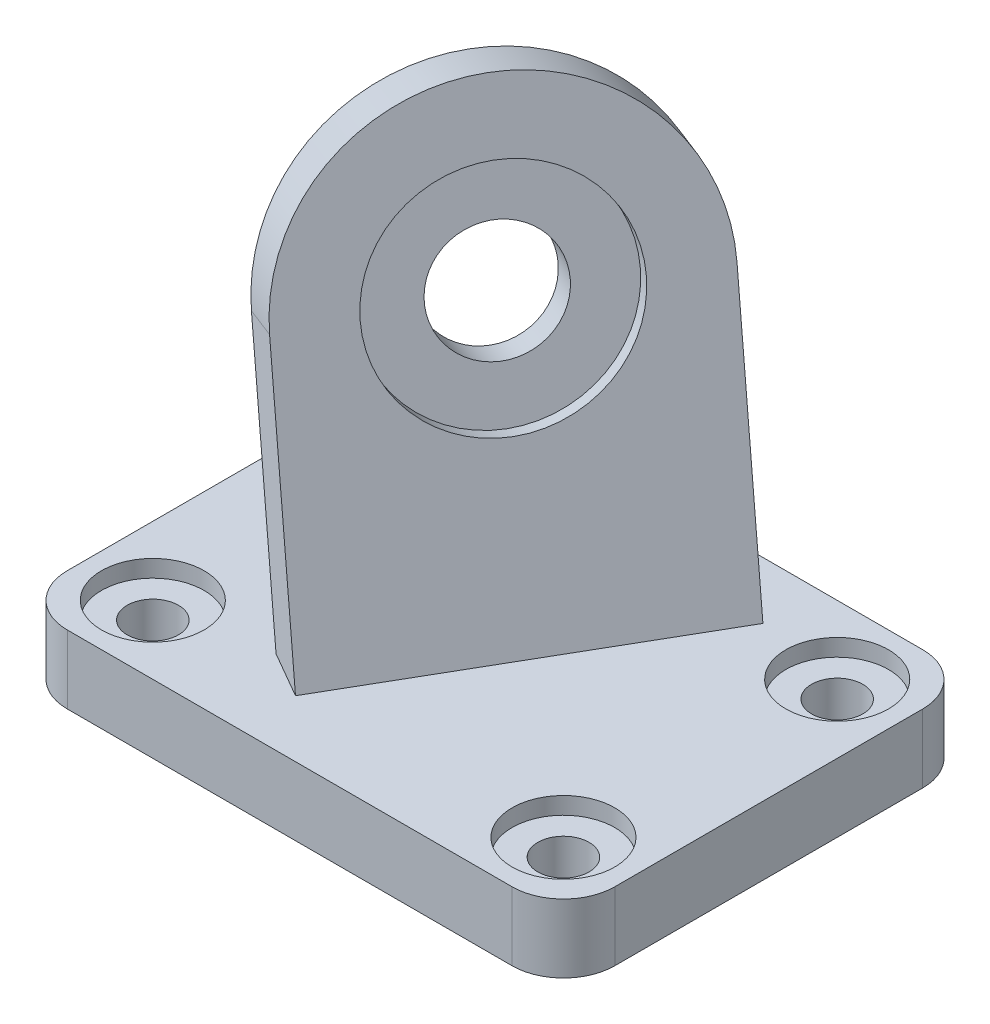
ISO-10303-21;
HEADER;
FILE_DESCRIPTION(('STEP AP214'),'2;1');
FILE_NAME('part.step','',(''),(''),'','','');
FILE_SCHEMA(('AUTOMOTIVE_DESIGN { 1 0 10303 214 1 1 1 1 }'));
ENDSEC;
DATA;
#1=APPLICATION_CONTEXT('core data for automotive mechanical design processes');
#2=APPLICATION_PROTOCOL_DEFINITION('international standard','automotive_design',2000,#1);
#3=PRODUCT_CONTEXT('',#1,'mechanical');
#4=PRODUCT('Part','Part','',(#3));
#5=PRODUCT_RELATED_PRODUCT_CATEGORY('part','',(#4));
#6=PRODUCT_DEFINITION_FORMATION('','',#4);
#7=PRODUCT_DEFINITION_CONTEXT('part definition',#1,'design');
#8=PRODUCT_DEFINITION('design','',#6,#7);
#9=PRODUCT_DEFINITION_SHAPE('','',#8);
#10=(LENGTH_UNIT() NAMED_UNIT(*) SI_UNIT(.MILLI.,.METRE.));
#11=(NAMED_UNIT(*) PLANE_ANGLE_UNIT() SI_UNIT($,.RADIAN.));
#12=(NAMED_UNIT(*) SI_UNIT($,.STERADIAN.) SOLID_ANGLE_UNIT());
#13=UNCERTAINTY_MEASURE_WITH_UNIT(LENGTH_MEASURE(1.E-05),#10,'distance_accuracy_value','');
#14=(GEOMETRIC_REPRESENTATION_CONTEXT(3) GLOBAL_UNCERTAINTY_ASSIGNED_CONTEXT((#13)) GLOBAL_UNIT_ASSIGNED_CONTEXT((#10,
#11,#12)) REPRESENTATION_CONTEXT('',''));
#15=CARTESIAN_POINT('',(0.,0.,0.));
#16=DIRECTION('',(0.,0.,1.));
#17=DIRECTION('',(1.,0.,0.));
#18=AXIS2_PLACEMENT_3D('',#15,#16,#17);
#19=CARTESIAN_POINT('',(50.8,12.7,38.1));
#20=DIRECTION('',(-1.,0.,0.));
#21=DIRECTION('',(0.,0.,1.));
#22=AXIS2_PLACEMENT_3D('',#19,#20,#21);
#23=PLANE('',#22);
#24=DIRECTION('',(0.,0.,-1.));
#25=VECTOR('',#24,1.);
#26=CARTESIAN_POINT('',(50.8,0.,38.1));
#27=LINE('',#26,#25);
#28=CARTESIAN_POINT('',(50.8,0.,28.575));
#29=VERTEX_POINT('',#28);
#30=CARTESIAN_POINT('',(50.8,0.,-28.575));
#31=VERTEX_POINT('',#30);
#32=EDGE_CURVE('E164',#29,#31,#27,.T.);
#33=ORIENTED_EDGE('',*,*,#32,.T.);
#34=DIRECTION('',(0.,-1.,0.));
#35=VECTOR('',#34,1.);
#36=CARTESIAN_POINT('',(50.8,12.7,-28.575));
#37=LINE('',#36,#35);
#38=CARTESIAN_POINT('',(50.8,12.7,-28.575));
#39=VERTEX_POINT('',#38);
#40=EDGE_CURVE('E11',#31,#39,#37,.F.);
#41=ORIENTED_EDGE('',*,*,#40,.T.);
#42=DIRECTION('',(0.,0.,-1.));
#43=VECTOR('',#42,1.);
#44=CARTESIAN_POINT('',(50.8,12.7,38.1));
#45=LINE('',#44,#43);
#46=CARTESIAN_POINT('',(50.8,12.7,28.575));
#47=VERTEX_POINT('',#46);
#48=EDGE_CURVE('E166',#47,#39,#45,.T.);
#49=ORIENTED_EDGE('',*,*,#48,.F.);
#50=DIRECTION('',(0.,-1.,0.));
#51=VECTOR('',#50,1.);
#52=CARTESIAN_POINT('',(50.8,12.7,28.575));
#53=LINE('',#52,#51);
#54=EDGE_CURVE('E44',#47,#29,#53,.T.);
#55=ORIENTED_EDGE('',*,*,#54,.T.);
#56=EDGE_LOOP('',(#33,#41,#49,#55));
#57=FACE_BOUND('',#56,.T.);
#58=ADVANCED_FACE('F36',(#57),#23,.F.);
#59=CARTESIAN_POINT('',(-50.8,12.7,-38.1));
#60=DIRECTION('',(0.,0.,1.));
#61=DIRECTION('',(1.,0.,0.));
#62=AXIS2_PLACEMENT_3D('',#59,#60,#61);
#63=PLANE('',#62);
#64=DIRECTION('',(-1.,0.,0.));
#65=VECTOR('',#64,1.);
#66=CARTESIAN_POINT('',(-50.8,0.,-38.1));
#67=LINE('',#66,#65);
#68=CARTESIAN_POINT('',(41.275,0.,-38.1));
#69=VERTEX_POINT('',#68);
#70=CARTESIAN_POINT('',(-41.275,0.,-38.1));
#71=VERTEX_POINT('',#70);
#72=EDGE_CURVE('E179',#69,#71,#67,.T.);
#73=ORIENTED_EDGE('',*,*,#72,.T.);
#74=DIRECTION('',(0.,-1.,0.));
#75=VECTOR('',#74,1.);
#76=CARTESIAN_POINT('',(-41.275,12.7,-38.1));
#77=LINE('',#76,#75);
#78=CARTESIAN_POINT('',(-41.275,12.7,-38.1));
#79=VERTEX_POINT('',#78);
#80=EDGE_CURVE('E51',#71,#79,#77,.F.);
#81=ORIENTED_EDGE('',*,*,#80,.T.);
#82=DIRECTION('',(-1.,0.,0.));
#83=VECTOR('',#82,1.);
#84=CARTESIAN_POINT('',(-50.8,12.7,-38.1));
#85=LINE('',#84,#83);
#86=CARTESIAN_POINT('',(41.275,12.7,-38.1));
#87=VERTEX_POINT('',#86);
#88=EDGE_CURVE('E168',#87,#79,#85,.T.);
#89=ORIENTED_EDGE('',*,*,#88,.F.);
#90=DIRECTION('',(0.,-1.,0.));
#91=VECTOR('',#90,1.);
#92=CARTESIAN_POINT('',(41.275,12.7,-38.1));
#93=LINE('',#92,#91);
#94=EDGE_CURVE('E219',#87,#69,#93,.T.);
#95=ORIENTED_EDGE('',*,*,#94,.T.);
#96=EDGE_LOOP('',(#73,#81,#89,#95));
#97=FACE_BOUND('',#96,.T.);
#98=ADVANCED_FACE('F237',(#97),#63,.F.);
#99=CARTESIAN_POINT('',(-50.8,12.7,38.1));
#100=DIRECTION('',(1.,0.,0.));
#101=DIRECTION('',(0.,0.,-1.));
#102=AXIS2_PLACEMENT_3D('',#99,#100,#101);
#103=PLANE('',#102);
#104=DIRECTION('',(0.,0.,1.));
#105=VECTOR('',#104,1.);
#106=CARTESIAN_POINT('',(-50.8,0.,38.1));
#107=LINE('',#106,#105);
#108=CARTESIAN_POINT('',(-50.8,0.,-28.575));
#109=VERTEX_POINT('',#108);
#110=CARTESIAN_POINT('',(-50.8,0.,28.575));
#111=VERTEX_POINT('',#110);
#112=EDGE_CURVE('E181',#109,#111,#107,.T.);
#113=ORIENTED_EDGE('',*,*,#112,.T.);
#114=DIRECTION('',(0.,-1.,0.));
#115=VECTOR('',#114,1.);
#116=CARTESIAN_POINT('',(-50.8,12.7,28.575));
#117=LINE('',#116,#115);
#118=CARTESIAN_POINT('',(-50.8,12.7,28.575));
#119=VERTEX_POINT('',#118);
#120=EDGE_CURVE('E210',#111,#119,#117,.F.);
#121=ORIENTED_EDGE('',*,*,#120,.T.);
#122=DIRECTION('',(0.,0.,1.));
#123=VECTOR('',#122,1.);
#124=CARTESIAN_POINT('',(-50.8,12.7,38.1));
#125=LINE('',#124,#123);
#126=CARTESIAN_POINT('',(-50.8,12.7,-28.575));
#127=VERTEX_POINT('',#126);
#128=EDGE_CURVE('E171',#127,#119,#125,.T.);
#129=ORIENTED_EDGE('',*,*,#128,.F.);
#130=DIRECTION('',(0.,-1.,0.));
#131=VECTOR('',#130,1.);
#132=CARTESIAN_POINT('',(-50.8,12.7,-28.575));
#133=LINE('',#132,#131);
#134=EDGE_CURVE('E207',#127,#109,#133,.T.);
#135=ORIENTED_EDGE('',*,*,#134,.T.);
#136=EDGE_LOOP('',(#113,#121,#129,#135));
#137=FACE_BOUND('',#136,.T.);
#138=ADVANCED_FACE('F246',(#137),#103,.F.);
#139=CARTESIAN_POINT('',(-50.8,12.7,38.1));
#140=DIRECTION('',(0.,0.,-1.));
#141=DIRECTION('',(-1.,0.,0.));
#142=AXIS2_PLACEMENT_3D('',#139,#140,#141);
#143=PLANE('',#142);
#144=DIRECTION('',(1.,0.,0.));
#145=VECTOR('',#144,1.);
#146=CARTESIAN_POINT('',(-50.8,12.7,38.1));
#147=LINE('',#146,#145);
#148=CARTESIAN_POINT('',(-41.275,12.7,38.1));
#149=VERTEX_POINT('',#148);
#150=CARTESIAN_POINT('',(41.275,12.7,38.1));
#151=VERTEX_POINT('',#150);
#152=EDGE_CURVE('E174',#149,#151,#147,.T.);
#153=ORIENTED_EDGE('',*,*,#152,.F.);
#154=DIRECTION('',(0.,-1.,0.));
#155=VECTOR('',#154,1.);
#156=CARTESIAN_POINT('',(-41.275,12.7,38.1));
#157=LINE('',#156,#155);
#158=CARTESIAN_POINT('',(-41.275,0.,38.1));
#159=VERTEX_POINT('',#158);
#160=EDGE_CURVE('E196',#149,#159,#157,.T.);
#161=ORIENTED_EDGE('',*,*,#160,.T.);
#162=DIRECTION('',(1.,0.,0.));
#163=VECTOR('',#162,1.);
#164=CARTESIAN_POINT('',(-50.8,0.,38.1));
#165=LINE('',#164,#163);
#166=CARTESIAN_POINT('',(41.275,0.,38.1));
#167=VERTEX_POINT('',#166);
#168=EDGE_CURVE('E169',#159,#167,#165,.T.);
#169=ORIENTED_EDGE('',*,*,#168,.T.);
#170=DIRECTION('',(0.,-1.,0.));
#171=VECTOR('',#170,1.);
#172=CARTESIAN_POINT('',(41.275,12.7,38.1));
#173=LINE('',#172,#171);
#174=EDGE_CURVE('E191',#167,#151,#173,.F.);
#175=ORIENTED_EDGE('',*,*,#174,.T.);
#176=EDGE_LOOP('',(#153,#161,#169,#175));
#177=FACE_BOUND('',#176,.T.);
#178=ADVANCED_FACE('F254',(#177),#143,.F.);
#179=CARTESIAN_POINT('',(0.,12.7,0.));
#180=DIRECTION('',(0.,-1.,0.));
#181=DIRECTION('',(0.,0.,-1.));
#182=AXIS2_PLACEMENT_3D('',#179,#180,#181);
#183=PLANE('',#182);
#184=CARTESIAN_POINT('',(-38.1,12.7,-25.4));
#185=DIRECTION('',(0.,1.,0.));
#186=DIRECTION('',(0.,0.,1.));
#187=AXIS2_PLACEMENT_3D('',#184,#185,#186);
#188=CIRCLE('',#187,9.525);
#189=CARTESIAN_POINT('',(-38.1,12.7,-15.875));
#190=VERTEX_POINT('',#189);
#191=EDGE_CURVE('E534',#190,#190,#188,.T.);
#192=ORIENTED_EDGE('',*,*,#191,.F.);
#193=EDGE_LOOP('',(#192));
#194=FACE_BOUND('',#193,.T.);
#195=CARTESIAN_POINT('',(38.1,12.7,-25.4));
#196=DIRECTION('',(0.,1.,0.));
#197=DIRECTION('',(0.,0.,1.));
#198=AXIS2_PLACEMENT_3D('',#195,#196,#197);
#199=CIRCLE('',#198,9.525);
#200=CARTESIAN_POINT('',(38.1,12.7,-15.875));
#201=VERTEX_POINT('',#200);
#202=EDGE_CURVE('E538',#201,#201,#199,.T.);
#203=ORIENTED_EDGE('',*,*,#202,.F.);
#204=EDGE_LOOP('',(#203));
#205=FACE_BOUND('',#204,.T.);
#206=CARTESIAN_POINT('',(38.1,12.7,25.4));
#207=DIRECTION('',(0.,1.,0.));
#208=DIRECTION('',(0.,0.,1.));
#209=AXIS2_PLACEMENT_3D('',#206,#207,#208);
#210=CIRCLE('',#209,9.525);
#211=CARTESIAN_POINT('',(38.1,12.7,34.925));
#212=VERTEX_POINT('',#211);
#213=EDGE_CURVE('E542',#212,#212,#210,.T.);
#214=ORIENTED_EDGE('',*,*,#213,.F.);
#215=EDGE_LOOP('',(#214));
#216=FACE_BOUND('',#215,.T.);
#217=CARTESIAN_POINT('',(-38.1,12.7,25.4));
#218=DIRECTION('',(0.,1.,0.));
#219=DIRECTION('',(0.,0.,1.));
#220=AXIS2_PLACEMENT_3D('',#217,#218,#219);
#221=CIRCLE('',#220,9.525);
#222=CARTESIAN_POINT('',(-38.1,12.7,34.925));
#223=VERTEX_POINT('',#222);
#224=EDGE_CURVE('E546',#223,#223,#221,.T.);
#225=ORIENTED_EDGE('',*,*,#224,.F.);
#226=EDGE_LOOP('',(#225));
#227=FACE_BOUND('',#226,.T.);
#228=DIRECTION('',(-0.866025403784439,0.,-0.5));
#229=VECTOR('',#228,1.);
#230=CARTESIAN_POINT('',(-14.2875,12.7,24.7466759131403));
#231=LINE('',#230,#229);
#232=CARTESIAN_POINT('',(-9.525,12.7,27.4963065701559));
#233=VERTEX_POINT('',#232);
#234=CARTESIAN_POINT('',(-18.0648813724007,12.7,22.5658037609529));
#235=VERTEX_POINT('',#234);
#236=EDGE_CURVE('E187',#233,#235,#231,.T.);
#237=ORIENTED_EDGE('',*,*,#236,.T.);
#238=DIRECTION('',(0.5,0.,-0.866025403784439));
#239=VECTOR('',#238,1.);
#240=CARTESIAN_POINT('',(-3.7773813724007,12.7,-2.18087215218742));
#241=LINE('',#240,#239);
#242=CARTESIAN_POINT('',(13.6851186275993,12.7,-32.426809379359));
#243=VERTEX_POINT('',#242);
#244=EDGE_CURVE('E189',#235,#243,#241,.T.);
#245=ORIENTED_EDGE('',*,*,#244,.T.);
#246=DIRECTION('',(0.866025403784439,0.,0.5));
#247=VECTOR('',#246,1.);
#248=CARTESIAN_POINT('',(17.4625,12.7,-30.2459372271715));
#249=LINE('',#248,#247);
#250=CARTESIAN_POINT('',(22.225,12.7,-27.4963065701559));
#251=VERTEX_POINT('',#250);
#252=EDGE_CURVE('E132',#243,#251,#249,.T.);
#253=ORIENTED_EDGE('',*,*,#252,.T.);
#254=DIRECTION('',(0.5,0.,-0.866025403784439));
#255=VECTOR('',#254,1.);
#256=CARTESIAN_POINT('',(-9.52499999999999,12.7,27.4963065701559));
#257=LINE('',#256,#255);
#258=EDGE_CURVE('E155',#233,#251,#257,.T.);
#259=ORIENTED_EDGE('',*,*,#258,.F.);
#260=EDGE_LOOP('',(#237,#245,#253,#259));
#261=FACE_BOUND('',#260,.T.);
#262=ORIENTED_EDGE('',*,*,#128,.T.);
#263=CARTESIAN_POINT('',(-41.275,12.7,28.575));
#264=DIRECTION('',(0.,-1.,0.));
#265=DIRECTION('',(0.,0.,-1.));
#266=AXIS2_PLACEMENT_3D('',#263,#264,#265);
#267=CIRCLE('',#266,9.525);
#268=EDGE_CURVE('E217',#119,#149,#267,.F.);
#269=ORIENTED_EDGE('',*,*,#268,.T.);
#270=ORIENTED_EDGE('',*,*,#152,.T.);
#271=CARTESIAN_POINT('',(41.275,12.7,28.575));
#272=DIRECTION('',(0.,-1.,0.));
#273=DIRECTION('',(0.,0.,-1.));
#274=AXIS2_PLACEMENT_3D('',#271,#272,#273);
#275=CIRCLE('',#274,9.525);
#276=EDGE_CURVE('E212',#151,#47,#275,.F.);
#277=ORIENTED_EDGE('',*,*,#276,.T.);
#278=ORIENTED_EDGE('',*,*,#48,.T.);
#279=CARTESIAN_POINT('',(41.275,12.7,-28.575));
#280=DIRECTION('',(0.,-1.,0.));
#281=DIRECTION('',(0.,0.,-1.));
#282=AXIS2_PLACEMENT_3D('',#279,#280,#281);
#283=CIRCLE('',#282,9.525);
#284=EDGE_CURVE('E58',#39,#87,#283,.F.);
#285=ORIENTED_EDGE('',*,*,#284,.T.);
#286=ORIENTED_EDGE('',*,*,#88,.T.);
#287=CARTESIAN_POINT('',(-41.275,12.7,-28.575));
#288=DIRECTION('',(0.,-1.,0.));
#289=DIRECTION('',(0.,0.,-1.));
#290=AXIS2_PLACEMENT_3D('',#287,#288,#289);
#291=CIRCLE('',#290,9.525);
#292=EDGE_CURVE('E215',#79,#127,#291,.F.);
#293=ORIENTED_EDGE('',*,*,#292,.T.);
#294=EDGE_LOOP('',(#262,#269,#270,#277,#278,#285,#286,#293));
#295=FACE_BOUND('',#294,.T.);
#296=ADVANCED_FACE('F239',(#194,#205,#216,#227,#261,#295),#183,.F.);
#297=CARTESIAN_POINT('',(0.,0.,0.));
#298=DIRECTION('',(0.,-1.,0.));
#299=DIRECTION('',(0.,0.,-1.));
#300=AXIS2_PLACEMENT_3D('',#297,#298,#299);
#301=PLANE('',#300);
#302=CARTESIAN_POINT('',(-38.1,0.,-25.4));
#303=DIRECTION('',(0.,1.,0.));
#304=DIRECTION('',(0.,0.,1.));
#305=AXIS2_PLACEMENT_3D('',#302,#303,#304);
#306=CIRCLE('',#305,4.7625);
#307=CARTESIAN_POINT('',(-38.1,0.,-20.6375));
#308=VERTEX_POINT('',#307);
#309=EDGE_CURVE('E602',#308,#308,#306,.T.);
#310=ORIENTED_EDGE('',*,*,#309,.T.);
#311=EDGE_LOOP('',(#310));
#312=FACE_BOUND('',#311,.T.);
#313=CARTESIAN_POINT('',(38.1,0.,-25.4));
#314=DIRECTION('',(0.,1.,0.));
#315=DIRECTION('',(0.,0.,1.));
#316=AXIS2_PLACEMENT_3D('',#313,#314,#315);
#317=CIRCLE('',#316,4.7625);
#318=CARTESIAN_POINT('',(38.1,0.,-20.6375));
#319=VERTEX_POINT('',#318);
#320=EDGE_CURVE('E592',#319,#319,#317,.T.);
#321=ORIENTED_EDGE('',*,*,#320,.T.);
#322=EDGE_LOOP('',(#321));
#323=FACE_BOUND('',#322,.T.);
#324=CARTESIAN_POINT('',(38.1,0.,25.4));
#325=DIRECTION('',(0.,1.,0.));
#326=DIRECTION('',(0.,0.,1.));
#327=AXIS2_PLACEMENT_3D('',#324,#325,#326);
#328=CIRCLE('',#327,4.7625);
#329=CARTESIAN_POINT('',(38.1,0.,30.1625));
#330=VERTEX_POINT('',#329);
#331=EDGE_CURVE('E582',#330,#330,#328,.T.);
#332=ORIENTED_EDGE('',*,*,#331,.T.);
#333=EDGE_LOOP('',(#332));
#334=FACE_BOUND('',#333,.T.);
#335=CARTESIAN_POINT('',(-38.1,0.,25.4));
#336=DIRECTION('',(0.,1.,0.));
#337=DIRECTION('',(0.,0.,1.));
#338=AXIS2_PLACEMENT_3D('',#335,#336,#337);
#339=CIRCLE('',#338,4.7625);
#340=CARTESIAN_POINT('',(-38.1,0.,30.1625));
#341=VERTEX_POINT('',#340);
#342=EDGE_CURVE('E572',#341,#341,#339,.T.);
#343=ORIENTED_EDGE('',*,*,#342,.T.);
#344=EDGE_LOOP('',(#343));
#345=FACE_BOUND('',#344,.T.);
#346=ORIENTED_EDGE('',*,*,#168,.F.);
#347=CARTESIAN_POINT('',(-41.275,0.,28.575));
#348=DIRECTION('',(0.,-1.,0.));
#349=DIRECTION('',(0.,0.,-1.));
#350=AXIS2_PLACEMENT_3D('',#347,#348,#349);
#351=CIRCLE('',#350,9.525);
#352=EDGE_CURVE('E205',#159,#111,#351,.T.);
#353=ORIENTED_EDGE('',*,*,#352,.T.);
#354=ORIENTED_EDGE('',*,*,#112,.F.);
#355=CARTESIAN_POINT('',(-41.275,0.,-28.575));
#356=DIRECTION('',(0.,-1.,0.));
#357=DIRECTION('',(0.,0.,-1.));
#358=AXIS2_PLACEMENT_3D('',#355,#356,#357);
#359=CIRCLE('',#358,9.525);
#360=EDGE_CURVE('E203',#109,#71,#359,.T.);
#361=ORIENTED_EDGE('',*,*,#360,.T.);
#362=ORIENTED_EDGE('',*,*,#72,.F.);
#363=CARTESIAN_POINT('',(41.275,0.,-28.575));
#364=DIRECTION('',(0.,-1.,0.));
#365=DIRECTION('',(0.,0.,-1.));
#366=AXIS2_PLACEMENT_3D('',#363,#364,#365);
#367=CIRCLE('',#366,9.525);
#368=EDGE_CURVE('E201',#69,#31,#367,.T.);
#369=ORIENTED_EDGE('',*,*,#368,.T.);
#370=ORIENTED_EDGE('',*,*,#32,.F.);
#371=CARTESIAN_POINT('',(41.275,0.,28.575));
#372=DIRECTION('',(0.,-1.,0.));
#373=DIRECTION('',(0.,0.,-1.));
#374=AXIS2_PLACEMENT_3D('',#371,#372,#373);
#375=CIRCLE('',#374,9.525);
#376=EDGE_CURVE('E199',#29,#167,#375,.T.);
#377=ORIENTED_EDGE('',*,*,#376,.T.);
#378=EDGE_LOOP('',(#346,#353,#354,#361,#362,#369,#370,#377));
#379=FACE_BOUND('',#378,.T.);
#380=ADVANCED_FACE('F232',(#312,#323,#334,#345,#379),#301,.T.);
#381=CARTESIAN_POINT('',(-17.4928177931026,10.2347485953985,22.8960848224542));
#382=DIRECTION('',(-0.5,0.,0.866025403784439));
#383=DIRECTION('',(0.866025403784439,0.,0.5));
#384=AXIS2_PLACEMENT_3D('',#381,#382,#383);
#385=PLANE('',#384);
#386=ORIENTED_EDGE('',*,*,#236,.F.);
#387=DIRECTION('',(0.224143868042011,-0.965925826289069,0.129409522551259));
#388=VECTOR('',#387,1.);
#389=CARTESIAN_POINT('',(-9.52499999999999,12.7,27.4963065701559));
#390=LINE('',#389,#388);
#391=CARTESIAN_POINT('',(-20.9115084965342,61.7690319754847,20.922302824552));
#392=VERTEX_POINT('',#391);
#393=EDGE_CURVE('E137',#392,#233,#390,.T.);
#394=ORIENTED_EDGE('',*,*,#393,.F.);
#395=DIRECTION('',(0.836516303737808,0.258819045102518,0.482962913144534));
#396=VECTOR('',#395,1.);
#397=CARTESIAN_POINT('',(-28.8793262896368,59.3037805708832,16.3220810768503));
#398=LINE('',#397,#396);
#399=CARTESIAN_POINT('',(-28.8793262896368,59.3037805708832,16.3220810768503));
#400=VERTEX_POINT('',#399);
#401=EDGE_CURVE('E146',#400,#392,#398,.T.);
#402=ORIENTED_EDGE('',*,*,#401,.F.);
#403=DIRECTION('',(0.224143868042011,-0.965925826289069,0.129409522551259));
#404=VECTOR('',#403,1.);
#405=CARTESIAN_POINT('',(-17.4928177931026,10.2347485953985,22.8960848224542));
#406=LINE('',#405,#404);
#407=EDGE_CURVE('E147',#400,#235,#406,.T.);
#408=ORIENTED_EDGE('',*,*,#407,.T.);
#409=EDGE_LOOP('',(#386,#394,#402,#408));
#410=FACE_BOUND('',#409,.T.);
#411=ADVANCED_FACE('F459',(#410),#385,.T.);
#412=CARTESIAN_POINT('',(14.2571822068974,10.2347485953985,-32.0965283178576));
#413=DIRECTION('',(0.5,0.,-0.866025403784439));
#414=DIRECTION('',(-0.866025403784439,0.,-0.5));
#415=AXIS2_PLACEMENT_3D('',#412,#413,#414);
#416=PLANE('',#415);
#417=ORIENTED_EDGE('',*,*,#252,.F.);
#418=DIRECTION('',(-0.224143868042011,0.965925826289069,-0.129409522551259));
#419=VECTOR('',#418,1.);
#420=CARTESIAN_POINT('',(14.2571822068974,10.2347485953985,-32.0965283178576));
#421=LINE('',#420,#419);
#422=CARTESIAN_POINT('',(2.87067371036323,59.3037805708832,-38.6705320634616));
#423=VERTEX_POINT('',#422);
#424=EDGE_CURVE('E126',#243,#423,#421,.T.);
#425=ORIENTED_EDGE('',*,*,#424,.T.);
#426=DIRECTION('',(0.836516303737808,0.258819045102518,0.482962913144534));
#427=VECTOR('',#426,1.);
#428=CARTESIAN_POINT('',(2.87067371036323,59.3037805708832,-38.6705320634616));
#429=LINE('',#428,#427);
#430=CARTESIAN_POINT('',(10.8384915034659,61.7690319754847,-34.0703103157599));
#431=VERTEX_POINT('',#430);
#432=EDGE_CURVE('E130',#423,#431,#429,.T.);
#433=ORIENTED_EDGE('',*,*,#432,.T.);
#434=DIRECTION('',(-0.224143868042011,0.965925826289069,-0.129409522551259));
#435=VECTOR('',#434,1.);
#436=CARTESIAN_POINT('',(22.225,12.7,-27.4963065701559));
#437=LINE('',#436,#435);
#438=EDGE_CURVE('E158',#251,#431,#437,.T.);
#439=ORIENTED_EDGE('',*,*,#438,.F.);
#440=EDGE_LOOP('',(#417,#425,#433,#439));
#441=FACE_BOUND('',#440,.T.);
#442=ADVANCED_FACE('F128',(#441),#416,.T.);
#443=CARTESIAN_POINT('',(-13.0043262896368,59.3037805708832,-11.1742254933056));
#444=DIRECTION('',(-0.836516303737809,-0.258819045102518,-0.482962913144534));
#445=DIRECTION('',(-0.5,0.,0.866025403784439));
#446=AXIS2_PLACEMENT_3D('',#443,#444,#445);
#447=PLANE('',#446);
#448=CARTESIAN_POINT('',(-13.0043262896368,59.3037805708832,-11.1742254933057));
#449=DIRECTION('',(-0.836516303737809,-0.258819045102518,-0.482962913144534));
#450=DIRECTION('',(-0.5,0.,0.866025403784439));
#451=AXIS2_PLACEMENT_3D('',#448,#449,#450);
#452=CIRCLE('',#451,9.92124000000001);
#453=CARTESIAN_POINT('',(-17.9649462896368,59.3037805708832,-2.58217961626332));
#454=VERTEX_POINT('',#453);
#455=EDGE_CURVE('E159',#454,#454,#452,.T.);
#456=ORIENTED_EDGE('',*,*,#455,.F.);
#457=EDGE_LOOP('',(#456));
#458=FACE_BOUND('',#457,.T.);
#459=ORIENTED_EDGE('',*,*,#244,.F.);
#460=ORIENTED_EDGE('',*,*,#407,.F.);
#461=CARTESIAN_POINT('',(-13.0043262896368,59.3037805708832,-11.1742254933056));
#462=DIRECTION('',(0.836516303737809,0.258819045102518,0.482962913144534));
#463=DIRECTION('',(-0.5,0.,0.866025403784439));
#464=AXIS2_PLACEMENT_3D('',#461,#462,#463);
#465=CIRCLE('',#464,31.75);
#466=EDGE_CURVE('E136',#423,#400,#465,.T.);
#467=ORIENTED_EDGE('',*,*,#466,.F.);
#468=ORIENTED_EDGE('',*,*,#424,.F.);
#469=EDGE_LOOP('',(#459,#460,#467,#468));
#470=FACE_BOUND('',#469,.T.);
#471=ADVANCED_FACE('F149',(#458,#470),#447,.T.);
#472=CARTESIAN_POINT('',(-13.0043262896368,59.3037805708832,-11.1742254933056));
#473=DIRECTION('',(0.836516303737808,0.258819045102518,0.482962913144534));
#474=DIRECTION('',(0.5,0.,-0.866025403784439));
#475=AXIS2_PLACEMENT_3D('',#472,#473,#474);
#476=CYLINDRICAL_SURFACE('',#475,31.75);
#477=CARTESIAN_POINT('',(-5.03650849653415,61.7690319754847,-6.57400374560396));
#478=DIRECTION('',(0.836516303737809,0.258819045102518,0.482962913144534));
#479=DIRECTION('',(-0.5,0.,0.866025403784439));
#480=AXIS2_PLACEMENT_3D('',#477,#478,#479);
#481=CIRCLE('',#480,31.75);
#482=EDGE_CURVE('E144',#431,#392,#481,.T.);
#483=ORIENTED_EDGE('',*,*,#482,.F.);
#484=ORIENTED_EDGE('',*,*,#432,.F.);
#485=ORIENTED_EDGE('',*,*,#466,.T.);
#486=ORIENTED_EDGE('',*,*,#401,.T.);
#487=EDGE_LOOP('',(#483,#484,#485,#486));
#488=FACE_BOUND('',#487,.T.);
#489=ADVANCED_FACE('F141',(#488),#476,.T.);
#490=CARTESIAN_POINT('',(-5.03650849653415,61.7690319754847,-6.57400374560396));
#491=DIRECTION('',(-0.836516303737809,-0.258819045102518,-0.482962913144534));
#492=DIRECTION('',(-0.5,0.,0.866025403784439));
#493=AXIS2_PLACEMENT_3D('',#490,#491,#492);
#494=PLANE('',#493);
#495=CARTESIAN_POINT('',(-5.03650849653415,61.7690319754847,-6.57400374560396));
#496=DIRECTION('',(0.836516303737809,0.258819045102518,0.482962913144534));
#497=DIRECTION('',(0.5,0.,-0.866025403784439));
#498=AXIS2_PLACEMENT_3D('',#495,#496,#497);
#499=CIRCLE('',#498,19.44624);
#500=CARTESIAN_POINT('',(4.68661150346585,61.7690319754847,-23.4149415936931));
#501=VERTEX_POINT('',#500);
#502=EDGE_CURVE('E551',#501,#501,#499,.T.);
#503=ORIENTED_EDGE('',*,*,#502,.F.);
#504=EDGE_LOOP('',(#503));
#505=FACE_BOUND('',#504,.T.);
#506=ORIENTED_EDGE('',*,*,#258,.T.);
#507=ORIENTED_EDGE('',*,*,#438,.T.);
#508=ORIENTED_EDGE('',*,*,#482,.T.);
#509=ORIENTED_EDGE('',*,*,#393,.T.);
#510=EDGE_LOOP('',(#506,#507,#508,#509));
#511=FACE_BOUND('',#510,.T.);
#512=ADVANCED_FACE('F427',(#505,#511),#494,.F.);
#513=CARTESIAN_POINT('',(-5.03650849653415,61.7690319754847,-6.57400374560396));
#514=DIRECTION('',(0.836516303737809,0.258819045102518,0.482962913144534));
#515=DIRECTION('',(0.5,0.,-0.866025403784439));
#516=AXIS2_PLACEMENT_3D('',#513,#514,#515);
#517=CYLINDRICAL_SURFACE('',#516,9.92124000000001);
#518=ORIENTED_EDGE('',*,*,#455,.T.);
#519=EDGE_LOOP('',(#518));
#520=FACE_BOUND('',#519,.T.);
#521=CARTESIAN_POINT('',(-7.69244776090169,60.9472815072842,-8.10741099483785));
#522=DIRECTION('',(0.836516303737809,0.258819045102518,0.482962913144534));
#523=DIRECTION('',(0.5,0.,-0.866025403784439));
#524=AXIS2_PLACEMENT_3D('',#521,#522,#523);
#525=CIRCLE('',#524,9.92124);
#526=CARTESIAN_POINT('',(-2.73182776090169,60.9472815072842,-16.6994568718802));
#527=VERTEX_POINT('',#526);
#528=EDGE_CURVE('E194',#527,#527,#525,.T.);
#529=ORIENTED_EDGE('',*,*,#528,.T.);
#530=EDGE_LOOP('',(#529));
#531=FACE_BOUND('',#530,.T.);
#532=ADVANCED_FACE('F418',(#520,#531),#517,.F.);
#533=CARTESIAN_POINT('',(-18.0229487124264,72.5971098370955,3.54241733497341));
#534=DIRECTION('',(-0.836516303737809,-0.258819045102518,-0.482962913144534));
#535=DIRECTION('',(-0.5,0.,0.866025403784439));
#536=AXIS2_PLACEMENT_3D('',#533,#534,#535);
#537=PLANE('',#536);
#538=ORIENTED_EDGE('',*,*,#528,.F.);
#539=EDGE_LOOP('',(#538));
#540=FACE_BOUND('',#539,.T.);
#541=CARTESIAN_POINT('',(-7.69244776090169,60.9472815072842,-8.10741099483785));
#542=DIRECTION('',(0.836516303737809,0.258819045102518,0.482962913144534));
#543=DIRECTION('',(0.5,0.,-0.866025403784439));
#544=AXIS2_PLACEMENT_3D('',#541,#542,#543);
#545=CIRCLE('',#544,19.44624);
#546=CARTESIAN_POINT('',(2.03067223909831,60.9472815072842,-24.948348842927));
#547=VERTEX_POINT('',#546);
#548=EDGE_CURVE('E555',#547,#547,#545,.T.);
#549=ORIENTED_EDGE('',*,*,#548,.T.);
#550=EDGE_LOOP('',(#549));
#551=FACE_BOUND('',#550,.T.);
#552=ADVANCED_FACE('F409',(#540,#551),#537,.F.);
#553=CARTESIAN_POINT('',(-5.03650849653415,61.7690319754847,-6.57400374560396));
#554=DIRECTION('',(0.836516303737809,0.258819045102518,0.482962913144534));
#555=DIRECTION('',(0.5,0.,-0.866025403784439));
#556=AXIS2_PLACEMENT_3D('',#553,#554,#555);
#557=CYLINDRICAL_SURFACE('',#556,19.44624);
#558=ORIENTED_EDGE('',*,*,#548,.F.);
#559=EDGE_LOOP('',(#558));
#560=FACE_BOUND('',#559,.T.);
#561=ORIENTED_EDGE('',*,*,#502,.T.);
#562=EDGE_LOOP('',(#561));
#563=FACE_BOUND('',#562,.T.);
#564=ADVANCED_FACE('F400',(#560,#563),#557,.F.);
#565=CARTESIAN_POINT('',(-38.1,12.7,25.4));
#566=DIRECTION('',(0.,1.,0.));
#567=DIRECTION('',(0.,0.,1.));
#568=AXIS2_PLACEMENT_3D('',#565,#566,#567);
#569=CYLINDRICAL_SURFACE('',#568,9.525);
#570=CARTESIAN_POINT('',(-38.1,9.525,25.4));
#571=DIRECTION('',(0.,1.,0.));
#572=DIRECTION('',(0.,0.,1.));
#573=AXIS2_PLACEMENT_3D('',#570,#571,#572);
#574=CIRCLE('',#573,9.525);
#575=CARTESIAN_POINT('',(-38.1,9.525,34.925));
#576=VERTEX_POINT('',#575);
#577=EDGE_CURVE('E552',#576,#576,#574,.T.);
#578=ORIENTED_EDGE('',*,*,#577,.F.);
#579=EDGE_LOOP('',(#578));
#580=FACE_BOUND('',#579,.T.);
#581=ORIENTED_EDGE('',*,*,#224,.T.);
#582=EDGE_LOOP('',(#581));
#583=FACE_BOUND('',#582,.T.);
#584=ADVANCED_FACE('F391',(#580,#583),#569,.F.);
#585=CARTESIAN_POINT('',(-28.575,9.525,25.4));
#586=DIRECTION('',(0.,-1.,0.));
#587=DIRECTION('',(0.,0.,-1.));
#588=AXIS2_PLACEMENT_3D('',#585,#586,#587);
#589=PLANE('',#588);
#590=CARTESIAN_POINT('',(-38.1,9.525,25.4));
#591=DIRECTION('',(0.,1.,0.));
#592=DIRECTION('',(0.,0.,1.));
#593=AXIS2_PLACEMENT_3D('',#590,#591,#592);
#594=CIRCLE('',#593,4.7625);
#595=CARTESIAN_POINT('',(-38.1,9.525,30.1625));
#596=VERTEX_POINT('',#595);
#597=EDGE_CURVE('E558',#596,#596,#594,.T.);
#598=ORIENTED_EDGE('',*,*,#597,.F.);
#599=EDGE_LOOP('',(#598));
#600=FACE_BOUND('',#599,.T.);
#601=ORIENTED_EDGE('',*,*,#577,.T.);
#602=EDGE_LOOP('',(#601));
#603=FACE_BOUND('',#602,.T.);
#604=ADVANCED_FACE('F382',(#600,#603),#589,.F.);
#605=CARTESIAN_POINT('',(-38.1,12.7,25.4));
#606=DIRECTION('',(0.,1.,0.));
#607=DIRECTION('',(0.,0.,1.));
#608=AXIS2_PLACEMENT_3D('',#605,#606,#607);
#609=CYLINDRICAL_SURFACE('',#608,4.7625);
#610=ORIENTED_EDGE('',*,*,#342,.F.);
#611=EDGE_LOOP('',(#610));
#612=FACE_BOUND('',#611,.T.);
#613=ORIENTED_EDGE('',*,*,#597,.T.);
#614=EDGE_LOOP('',(#613));
#615=FACE_BOUND('',#614,.T.);
#616=ADVANCED_FACE('F373',(#612,#615),#609,.F.);
#617=CARTESIAN_POINT('',(38.1,12.7,25.4));
#618=DIRECTION('',(0.,1.,0.));
#619=DIRECTION('',(0.,0.,1.));
#620=AXIS2_PLACEMENT_3D('',#617,#618,#619);
#621=CYLINDRICAL_SURFACE('',#620,9.525);
#622=CARTESIAN_POINT('',(38.1,9.525,25.4));
#623=DIRECTION('',(0.,1.,0.));
#624=DIRECTION('',(0.,0.,1.));
#625=AXIS2_PLACEMENT_3D('',#622,#623,#624);
#626=CIRCLE('',#625,9.525);
#627=CARTESIAN_POINT('',(38.1,9.525,34.925));
#628=VERTEX_POINT('',#627);
#629=EDGE_CURVE('E576',#628,#628,#626,.T.);
#630=ORIENTED_EDGE('',*,*,#629,.F.);
#631=EDGE_LOOP('',(#630));
#632=FACE_BOUND('',#631,.T.);
#633=ORIENTED_EDGE('',*,*,#213,.T.);
#634=EDGE_LOOP('',(#633));
#635=FACE_BOUND('',#634,.T.);
#636=ADVANCED_FACE('F364',(#632,#635),#621,.F.);
#637=CARTESIAN_POINT('',(47.625,9.525,25.4));
#638=DIRECTION('',(0.,-1.,0.));
#639=DIRECTION('',(0.,0.,-1.));
#640=AXIS2_PLACEMENT_3D('',#637,#638,#639);
#641=PLANE('',#640);
#642=CARTESIAN_POINT('',(38.1,9.525,25.4));
#643=DIRECTION('',(0.,1.,0.));
#644=DIRECTION('',(0.,0.,1.));
#645=AXIS2_PLACEMENT_3D('',#642,#643,#644);
#646=CIRCLE('',#645,4.7625);
#647=CARTESIAN_POINT('',(38.1,9.525,30.1625));
#648=VERTEX_POINT('',#647);
#649=EDGE_CURVE('E579',#648,#648,#646,.T.);
#650=ORIENTED_EDGE('',*,*,#649,.F.);
#651=EDGE_LOOP('',(#650));
#652=FACE_BOUND('',#651,.T.);
#653=ORIENTED_EDGE('',*,*,#629,.T.);
#654=EDGE_LOOP('',(#653));
#655=FACE_BOUND('',#654,.T.);
#656=ADVANCED_FACE('F355',(#652,#655),#641,.F.);
#657=CARTESIAN_POINT('',(38.1,12.7,25.4));
#658=DIRECTION('',(0.,1.,0.));
#659=DIRECTION('',(0.,0.,1.));
#660=AXIS2_PLACEMENT_3D('',#657,#658,#659);
#661=CYLINDRICAL_SURFACE('',#660,4.7625);
#662=ORIENTED_EDGE('',*,*,#331,.F.);
#663=EDGE_LOOP('',(#662));
#664=FACE_BOUND('',#663,.T.);
#665=ORIENTED_EDGE('',*,*,#649,.T.);
#666=EDGE_LOOP('',(#665));
#667=FACE_BOUND('',#666,.T.);
#668=ADVANCED_FACE('F346',(#664,#667),#661,.F.);
#669=CARTESIAN_POINT('',(38.1,12.7,-25.4));
#670=DIRECTION('',(0.,1.,0.));
#671=DIRECTION('',(0.,0.,1.));
#672=AXIS2_PLACEMENT_3D('',#669,#670,#671);
#673=CYLINDRICAL_SURFACE('',#672,9.525);
#674=CARTESIAN_POINT('',(38.1,9.525,-25.4));
#675=DIRECTION('',(0.,1.,0.));
#676=DIRECTION('',(0.,0.,1.));
#677=AXIS2_PLACEMENT_3D('',#674,#675,#676);
#678=CIRCLE('',#677,9.525);
#679=CARTESIAN_POINT('',(38.1,9.525,-15.875));
#680=VERTEX_POINT('',#679);
#681=EDGE_CURVE('E586',#680,#680,#678,.T.);
#682=ORIENTED_EDGE('',*,*,#681,.F.);
#683=EDGE_LOOP('',(#682));
#684=FACE_BOUND('',#683,.T.);
#685=ORIENTED_EDGE('',*,*,#202,.T.);
#686=EDGE_LOOP('',(#685));
#687=FACE_BOUND('',#686,.T.);
#688=ADVANCED_FACE('F337',(#684,#687),#673,.F.);
#689=CARTESIAN_POINT('',(47.625,9.525,-25.4));
#690=DIRECTION('',(0.,-1.,0.));
#691=DIRECTION('',(0.,0.,-1.));
#692=AXIS2_PLACEMENT_3D('',#689,#690,#691);
#693=PLANE('',#692);
#694=CARTESIAN_POINT('',(38.1,9.525,-25.4));
#695=DIRECTION('',(0.,1.,0.));
#696=DIRECTION('',(0.,0.,1.));
#697=AXIS2_PLACEMENT_3D('',#694,#695,#696);
#698=CIRCLE('',#697,4.7625);
#699=CARTESIAN_POINT('',(38.1,9.525,-20.6375));
#700=VERTEX_POINT('',#699);
#701=EDGE_CURVE('E589',#700,#700,#698,.T.);
#702=ORIENTED_EDGE('',*,*,#701,.F.);
#703=EDGE_LOOP('',(#702));
#704=FACE_BOUND('',#703,.T.);
#705=ORIENTED_EDGE('',*,*,#681,.T.);
#706=EDGE_LOOP('',(#705));
#707=FACE_BOUND('',#706,.T.);
#708=ADVANCED_FACE('F328',(#704,#707),#693,.F.);
#709=CARTESIAN_POINT('',(38.1,12.7,-25.4));
#710=DIRECTION('',(0.,1.,0.));
#711=DIRECTION('',(0.,0.,1.));
#712=AXIS2_PLACEMENT_3D('',#709,#710,#711);
#713=CYLINDRICAL_SURFACE('',#712,4.7625);
#714=ORIENTED_EDGE('',*,*,#320,.F.);
#715=EDGE_LOOP('',(#714));
#716=FACE_BOUND('',#715,.T.);
#717=ORIENTED_EDGE('',*,*,#701,.T.);
#718=EDGE_LOOP('',(#717));
#719=FACE_BOUND('',#718,.T.);
#720=ADVANCED_FACE('F319',(#716,#719),#713,.F.);
#721=CARTESIAN_POINT('',(-38.1,12.7,-25.4));
#722=DIRECTION('',(0.,1.,0.));
#723=DIRECTION('',(0.,0.,1.));
#724=AXIS2_PLACEMENT_3D('',#721,#722,#723);
#725=CYLINDRICAL_SURFACE('',#724,9.525);
#726=CARTESIAN_POINT('',(-38.1,9.525,-25.4));
#727=DIRECTION('',(0.,1.,0.));
#728=DIRECTION('',(0.,0.,1.));
#729=AXIS2_PLACEMENT_3D('',#726,#727,#728);
#730=CIRCLE('',#729,9.525);
#731=CARTESIAN_POINT('',(-38.1,9.525,-15.875));
#732=VERTEX_POINT('',#731);
#733=EDGE_CURVE('E596',#732,#732,#730,.T.);
#734=ORIENTED_EDGE('',*,*,#733,.F.);
#735=EDGE_LOOP('',(#734));
#736=FACE_BOUND('',#735,.T.);
#737=ORIENTED_EDGE('',*,*,#191,.T.);
#738=EDGE_LOOP('',(#737));
#739=FACE_BOUND('',#738,.T.);
#740=ADVANCED_FACE('F310',(#736,#739),#725,.F.);
#741=CARTESIAN_POINT('',(-28.575,9.525,-25.4));
#742=DIRECTION('',(0.,-1.,0.));
#743=DIRECTION('',(0.,0.,-1.));
#744=AXIS2_PLACEMENT_3D('',#741,#742,#743);
#745=PLANE('',#744);
#746=CARTESIAN_POINT('',(-38.1,9.525,-25.4));
#747=DIRECTION('',(0.,1.,0.));
#748=DIRECTION('',(0.,0.,1.));
#749=AXIS2_PLACEMENT_3D('',#746,#747,#748);
#750=CIRCLE('',#749,4.7625);
#751=CARTESIAN_POINT('',(-38.1,9.525,-20.6375));
#752=VERTEX_POINT('',#751);
#753=EDGE_CURVE('E599',#752,#752,#750,.T.);
#754=ORIENTED_EDGE('',*,*,#753,.F.);
#755=EDGE_LOOP('',(#754));
#756=FACE_BOUND('',#755,.T.);
#757=ORIENTED_EDGE('',*,*,#733,.T.);
#758=EDGE_LOOP('',(#757));
#759=FACE_BOUND('',#758,.T.);
#760=ADVANCED_FACE('F301',(#756,#759),#745,.F.);
#761=CARTESIAN_POINT('',(-38.1,12.7,-25.4));
#762=DIRECTION('',(0.,1.,0.));
#763=DIRECTION('',(0.,0.,1.));
#764=AXIS2_PLACEMENT_3D('',#761,#762,#763);
#765=CYLINDRICAL_SURFACE('',#764,4.7625);
#766=ORIENTED_EDGE('',*,*,#309,.F.);
#767=EDGE_LOOP('',(#766));
#768=FACE_BOUND('',#767,.T.);
#769=ORIENTED_EDGE('',*,*,#753,.T.);
#770=EDGE_LOOP('',(#769));
#771=FACE_BOUND('',#770,.T.);
#772=ADVANCED_FACE('F270',(#768,#771),#765,.F.);
#773=CARTESIAN_POINT('',(-41.275,12.7,28.575));
#774=DIRECTION('',(0.,-1.,0.));
#775=DIRECTION('',(0.,0.,-1.));
#776=AXIS2_PLACEMENT_3D('',#773,#774,#775);
#777=CYLINDRICAL_SURFACE('',#776,9.525);
#778=ORIENTED_EDGE('',*,*,#268,.F.);
#779=ORIENTED_EDGE('',*,*,#120,.F.);
#780=ORIENTED_EDGE('',*,*,#352,.F.);
#781=ORIENTED_EDGE('',*,*,#160,.F.);
#782=EDGE_LOOP('',(#778,#779,#780,#781));
#783=FACE_BOUND('',#782,.T.);
#784=ADVANCED_FACE('F251',(#783),#777,.T.);
#785=CARTESIAN_POINT('',(-41.275,12.7,-28.575));
#786=DIRECTION('',(0.,-1.,0.));
#787=DIRECTION('',(0.,0.,-1.));
#788=AXIS2_PLACEMENT_3D('',#785,#786,#787);
#789=CYLINDRICAL_SURFACE('',#788,9.525);
#790=ORIENTED_EDGE('',*,*,#292,.F.);
#791=ORIENTED_EDGE('',*,*,#80,.F.);
#792=ORIENTED_EDGE('',*,*,#360,.F.);
#793=ORIENTED_EDGE('',*,*,#134,.F.);
#794=EDGE_LOOP('',(#790,#791,#792,#793));
#795=FACE_BOUND('',#794,.T.);
#796=ADVANCED_FACE('F243',(#795),#789,.T.);
#797=CARTESIAN_POINT('',(41.275,12.7,-28.575));
#798=DIRECTION('',(0.,-1.,0.));
#799=DIRECTION('',(0.,0.,-1.));
#800=AXIS2_PLACEMENT_3D('',#797,#798,#799);
#801=CYLINDRICAL_SURFACE('',#800,9.525);
#802=ORIENTED_EDGE('',*,*,#284,.F.);
#803=ORIENTED_EDGE('',*,*,#40,.F.);
#804=ORIENTED_EDGE('',*,*,#368,.F.);
#805=ORIENTED_EDGE('',*,*,#94,.F.);
#806=EDGE_LOOP('',(#802,#803,#804,#805));
#807=FACE_BOUND('',#806,.T.);
#808=ADVANCED_FACE('F236',(#807),#801,.T.);
#809=CARTESIAN_POINT('',(41.275,12.7,28.575));
#810=DIRECTION('',(0.,-1.,0.));
#811=DIRECTION('',(0.,0.,-1.));
#812=AXIS2_PLACEMENT_3D('',#809,#810,#811);
#813=CYLINDRICAL_SURFACE('',#812,9.525);
#814=ORIENTED_EDGE('',*,*,#276,.F.);
#815=ORIENTED_EDGE('',*,*,#174,.F.);
#816=ORIENTED_EDGE('',*,*,#376,.F.);
#817=ORIENTED_EDGE('',*,*,#54,.F.);
#818=EDGE_LOOP('',(#814,#815,#816,#817));
#819=FACE_BOUND('',#818,.T.);
#820=ADVANCED_FACE('F38',(#819),#813,.T.);
#821=CLOSED_SHELL('',(#58,#98,#138,#178,#296,#380,#411,#442,#471,#489,#512,#532,#552,#564,#584,
#604,#616,#636,#656,#668,#688,#708,#720,#740,#760,#772,#784,#796,#808,#820));
#822=MANIFOLD_SOLID_BREP('B2',#821);
#823=ADVANCED_BREP_SHAPE_REPRESENTATION('',(#18,#822),#14);
#824=SHAPE_DEFINITION_REPRESENTATION(#9,#823);
ENDSEC;
END-ISO-10303-21;
